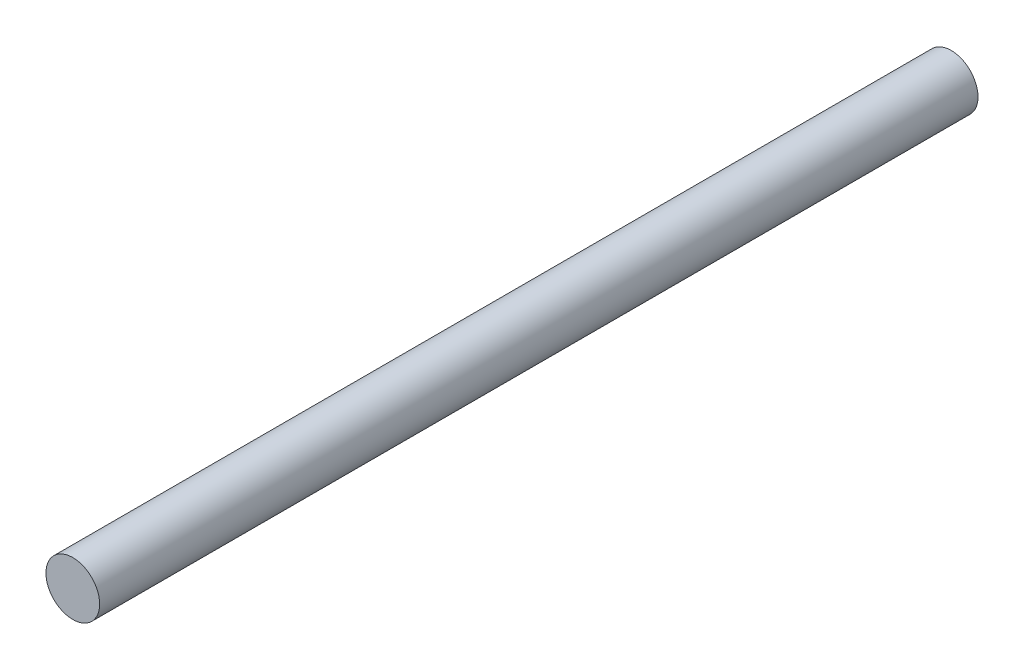
ISO-10303-21;
HEADER;
FILE_DESCRIPTION(('STEP AP214'),'2;1');
FILE_NAME('part.step','',(''),(''),'','','');
FILE_SCHEMA(('AUTOMOTIVE_DESIGN { 1 0 10303 214 1 1 1 1 }'));
ENDSEC;
DATA;
#1=APPLICATION_CONTEXT('core data for automotive mechanical design processes');
#2=APPLICATION_PROTOCOL_DEFINITION('international standard','automotive_design',2000,#1);
#3=PRODUCT_CONTEXT('',#1,'mechanical');
#4=PRODUCT('Part','Part','',(#3));
#5=PRODUCT_RELATED_PRODUCT_CATEGORY('part','',(#4));
#6=PRODUCT_DEFINITION_FORMATION('','',#4);
#7=PRODUCT_DEFINITION_CONTEXT('part definition',#1,'design');
#8=PRODUCT_DEFINITION('design','',#6,#7);
#9=PRODUCT_DEFINITION_SHAPE('','',#8);
#10=(LENGTH_UNIT() NAMED_UNIT(*) SI_UNIT(.MILLI.,.METRE.));
#11=(NAMED_UNIT(*) PLANE_ANGLE_UNIT() SI_UNIT($,.RADIAN.));
#12=(NAMED_UNIT(*) SI_UNIT($,.STERADIAN.) SOLID_ANGLE_UNIT());
#13=UNCERTAINTY_MEASURE_WITH_UNIT(LENGTH_MEASURE(1.E-05),#10,'distance_accuracy_value','');
#14=(GEOMETRIC_REPRESENTATION_CONTEXT(3) GLOBAL_UNCERTAINTY_ASSIGNED_CONTEXT((#13)) GLOBAL_UNIT_ASSIGNED_CONTEXT((#10,
#11,#12)) REPRESENTATION_CONTEXT('',''));
#15=CARTESIAN_POINT('',(0.,0.,0.));
#16=DIRECTION('',(0.,0.,1.));
#17=DIRECTION('',(1.,0.,0.));
#18=AXIS2_PLACEMENT_3D('',#15,#16,#17);
#19=CARTESIAN_POINT('',(0.,0.,103.886));
#20=DIRECTION('',(0.,0.,-1.));
#21=DIRECTION('',(-1.,0.,0.));
#22=AXIS2_PLACEMENT_3D('',#19,#20,#21);
#23=CYLINDRICAL_SURFACE('',#22,3.175);
#24=CARTESIAN_POINT('',(0.,0.,103.886));
#25=DIRECTION('',(0.,0.,1.));
#26=DIRECTION('',(1.,0.,0.));
#27=AXIS2_PLACEMENT_3D('',#24,#25,#26);
#28=CIRCLE('',#27,3.175);
#29=CARTESIAN_POINT('',(3.175,0.,103.886));
#30=VERTEX_POINT('',#29);
#31=EDGE_CURVE('E10',#30,#30,#28,.T.);
#32=ORIENTED_EDGE('',*,*,#31,.F.);
#33=EDGE_LOOP('',(#32));
#34=FACE_BOUND('',#33,.T.);
#35=CARTESIAN_POINT('',(0.,0.,0.));
#36=DIRECTION('',(0.,0.,1.));
#37=DIRECTION('',(1.,0.,0.));
#38=AXIS2_PLACEMENT_3D('',#35,#36,#37);
#39=CIRCLE('',#38,3.175);
#40=CARTESIAN_POINT('',(3.175,0.,0.));
#41=VERTEX_POINT('',#40);
#42=EDGE_CURVE('E42',#41,#41,#39,.T.);
#43=ORIENTED_EDGE('',*,*,#42,.T.);
#44=EDGE_LOOP('',(#43));
#45=FACE_BOUND('',#44,.T.);
#46=ADVANCED_FACE('F39',(#34,#45),#23,.T.);
#47=CARTESIAN_POINT('',(0.,0.,103.886));
#48=DIRECTION('',(0.,0.,1.));
#49=DIRECTION('',(1.,0.,0.));
#50=AXIS2_PLACEMENT_3D('',#47,#48,#49);
#51=PLANE('',#50);
#52=ORIENTED_EDGE('',*,*,#31,.T.);
#53=EDGE_LOOP('',(#52));
#54=FACE_BOUND('',#53,.T.);
#55=ADVANCED_FACE('F54',(#54),#51,.T.);
#56=CARTESIAN_POINT('',(0.,0.,0.));
#57=DIRECTION('',(0.,0.,1.));
#58=DIRECTION('',(1.,0.,0.));
#59=AXIS2_PLACEMENT_3D('',#56,#57,#58);
#60=PLANE('',#59);
#61=ORIENTED_EDGE('',*,*,#42,.F.);
#62=EDGE_LOOP('',(#61));
#63=FACE_BOUND('',#62,.T.);
#64=ADVANCED_FACE('F52',(#63),#60,.F.);
#65=CLOSED_SHELL('',(#46,#55,#64));
#66=MANIFOLD_SOLID_BREP('B2',#65);
#67=ADVANCED_BREP_SHAPE_REPRESENTATION('',(#18,#66),#14);
#68=SHAPE_DEFINITION_REPRESENTATION(#9,#67);
ENDSEC;
END-ISO-10303-21;
